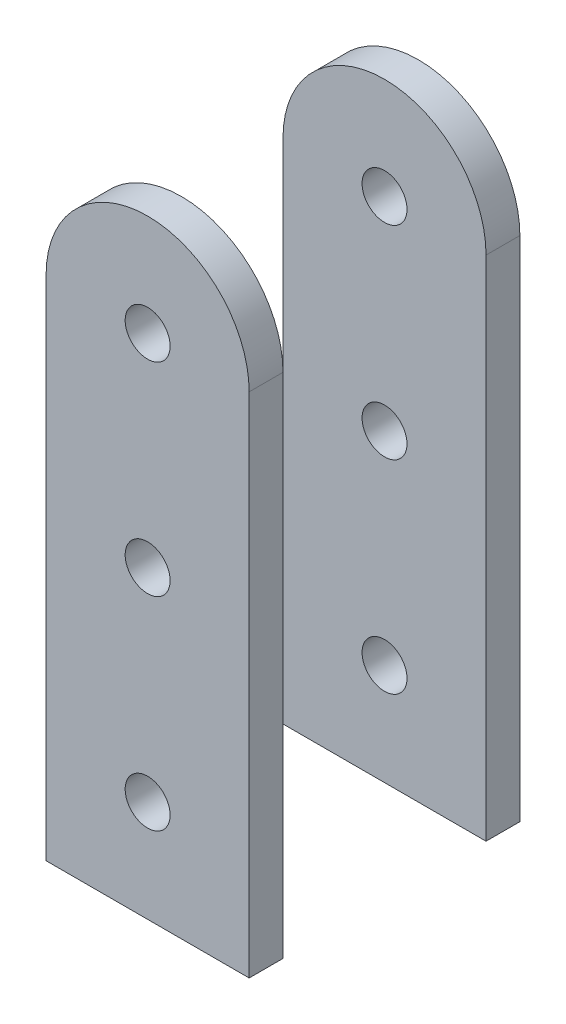
ISO-10303-21;
HEADER;
FILE_DESCRIPTION(('STEP AP214'),'2;1');
FILE_NAME('part.step','',(''),(''),'','','');
FILE_SCHEMA(('AUTOMOTIVE_DESIGN { 1 0 10303 214 1 1 1 1 }'));
ENDSEC;
DATA;
#1=APPLICATION_CONTEXT('core data for automotive mechanical design processes');
#2=APPLICATION_PROTOCOL_DEFINITION('international standard','automotive_design',2000,#1);
#3=PRODUCT_CONTEXT('',#1,'mechanical');
#4=PRODUCT('Part','Part','',(#3));
#5=PRODUCT_RELATED_PRODUCT_CATEGORY('part','',(#4));
#6=PRODUCT_DEFINITION_FORMATION('','',#4);
#7=PRODUCT_DEFINITION_CONTEXT('part definition',#1,'design');
#8=PRODUCT_DEFINITION('design','',#6,#7);
#9=PRODUCT_DEFINITION_SHAPE('','',#8);
#10=(LENGTH_UNIT() NAMED_UNIT(*) SI_UNIT(.MILLI.,.METRE.));
#11=(NAMED_UNIT(*) PLANE_ANGLE_UNIT() SI_UNIT($,.RADIAN.));
#12=(NAMED_UNIT(*) SI_UNIT($,.STERADIAN.) SOLID_ANGLE_UNIT());
#13=UNCERTAINTY_MEASURE_WITH_UNIT(LENGTH_MEASURE(1.E-05),#10,'distance_accuracy_value','');
#14=(GEOMETRIC_REPRESENTATION_CONTEXT(3) GLOBAL_UNCERTAINTY_ASSIGNED_CONTEXT((#13)) GLOBAL_UNIT_ASSIGNED_CONTEXT((#10,
#11,#12)) REPRESENTATION_CONTEXT('',''));
#15=CARTESIAN_POINT('',(0.,0.,0.));
#16=DIRECTION('',(0.,0.,1.));
#17=DIRECTION('',(1.,0.,0.));
#18=AXIS2_PLACEMENT_3D('',#15,#16,#17);
#19=CARTESIAN_POINT('',(-19.05,47.625,-50.8));
#20=DIRECTION('',(-1.,0.,0.));
#21=DIRECTION('',(0.,-1.,0.));
#22=AXIS2_PLACEMENT_3D('',#19,#20,#21);
#23=PLANE('',#22);
#24=DIRECTION('',(0.,1.,0.));
#25=VECTOR('',#24,1.);
#26=CARTESIAN_POINT('',(-19.05,47.625,-6.35));
#27=LINE('',#26,#25);
#28=CARTESIAN_POINT('',(-19.05,-47.625,-6.35));
#29=VERTEX_POINT('',#28);
#30=CARTESIAN_POINT('',(-19.05,47.625,-6.35));
#31=VERTEX_POINT('',#30);
#32=EDGE_CURVE('E118',#29,#31,#27,.T.);
#33=ORIENTED_EDGE('',*,*,#32,.F.);
#34=DIRECTION('',(0.,0.,1.));
#35=VECTOR('',#34,1.);
#36=CARTESIAN_POINT('',(-19.05,-47.625,-50.8));
#37=LINE('',#36,#35);
#38=CARTESIAN_POINT('',(-19.05,-47.625,0.));
#39=VERTEX_POINT('',#38);
#40=EDGE_CURVE('E57',#29,#39,#37,.T.);
#41=ORIENTED_EDGE('',*,*,#40,.T.);
#42=DIRECTION('',(0.,-1.,0.));
#43=VECTOR('',#42,1.);
#44=CARTESIAN_POINT('',(-19.05,47.625,0.));
#45=LINE('',#44,#43);
#46=CARTESIAN_POINT('',(-19.05,47.625,0.));
#47=VERTEX_POINT('',#46);
#48=EDGE_CURVE('E104',#47,#39,#45,.T.);
#49=ORIENTED_EDGE('',*,*,#48,.F.);
#50=DIRECTION('',(0.,0.,1.));
#51=VECTOR('',#50,1.);
#52=CARTESIAN_POINT('',(-19.05,47.625,-50.8));
#53=LINE('',#52,#51);
#54=EDGE_CURVE('E92',#31,#47,#53,.T.);
#55=ORIENTED_EDGE('',*,*,#54,.F.);
#56=EDGE_LOOP('',(#33,#41,#49,#55));
#57=FACE_BOUND('',#56,.T.);
#58=ADVANCED_FACE('F53',(#57),#23,.T.);
#59=CARTESIAN_POINT('',(0.,47.625,-50.8));
#60=DIRECTION('',(0.,0.,1.));
#61=DIRECTION('',(1.,0.,0.));
#62=AXIS2_PLACEMENT_3D('',#59,#60,#61);
#63=CYLINDRICAL_SURFACE('',#62,19.05);
#64=DIRECTION('',(0.,0.,1.));
#65=VECTOR('',#64,1.);
#66=CARTESIAN_POINT('',(19.05,47.625,-50.8));
#67=LINE('',#66,#65);
#68=CARTESIAN_POINT('',(19.05,47.625,-6.35));
#69=VERTEX_POINT('',#68);
#70=CARTESIAN_POINT('',(19.05,47.625,0.));
#71=VERTEX_POINT('',#70);
#72=EDGE_CURVE('E101',#69,#71,#67,.T.);
#73=ORIENTED_EDGE('',*,*,#72,.F.);
#74=CARTESIAN_POINT('',(0.,47.625,-6.35));
#75=DIRECTION('',(0.,0.,1.));
#76=DIRECTION('',(0.,-1.,0.));
#77=AXIS2_PLACEMENT_3D('',#74,#75,#76);
#78=CIRCLE('',#77,19.05);
#79=EDGE_CURVE('E64',#31,#69,#78,.F.);
#80=ORIENTED_EDGE('',*,*,#79,.F.);
#81=ORIENTED_EDGE('',*,*,#54,.T.);
#82=CARTESIAN_POINT('',(0.,47.625,0.));
#83=DIRECTION('',(0.,0.,1.));
#84=DIRECTION('',(-1.,0.,0.));
#85=AXIS2_PLACEMENT_3D('',#82,#83,#84);
#86=CIRCLE('',#85,19.05);
#87=EDGE_CURVE('E97',#71,#47,#86,.T.);
#88=ORIENTED_EDGE('',*,*,#87,.F.);
#89=EDGE_LOOP('',(#73,#80,#81,#88));
#90=FACE_BOUND('',#89,.T.);
#91=ADVANCED_FACE('F95',(#90),#63,.T.);
#92=CARTESIAN_POINT('',(19.05,47.625,-50.8));
#93=DIRECTION('',(1.,0.,0.));
#94=DIRECTION('',(0.,1.,0.));
#95=AXIS2_PLACEMENT_3D('',#92,#93,#94);
#96=PLANE('',#95);
#97=DIRECTION('',(0.,-1.,0.));
#98=VECTOR('',#97,1.);
#99=CARTESIAN_POINT('',(19.05,-47.625,-6.35));
#100=LINE('',#99,#98);
#101=CARTESIAN_POINT('',(19.05,-47.625,-6.35));
#102=VERTEX_POINT('',#101);
#103=EDGE_CURVE('E12',#69,#102,#100,.T.);
#104=ORIENTED_EDGE('',*,*,#103,.F.);
#105=ORIENTED_EDGE('',*,*,#72,.T.);
#106=DIRECTION('',(0.,1.,0.));
#107=VECTOR('',#106,1.);
#108=CARTESIAN_POINT('',(19.05,47.625,0.));
#109=LINE('',#108,#107);
#110=CARTESIAN_POINT('',(19.05,-47.625,0.));
#111=VERTEX_POINT('',#110);
#112=EDGE_CURVE('E116',#111,#71,#109,.T.);
#113=ORIENTED_EDGE('',*,*,#112,.F.);
#114=DIRECTION('',(0.,0.,1.));
#115=VECTOR('',#114,1.);
#116=CARTESIAN_POINT('',(19.05,-47.625,-50.8));
#117=LINE('',#116,#115);
#118=EDGE_CURVE('E147',#102,#111,#117,.T.);
#119=ORIENTED_EDGE('',*,*,#118,.F.);
#120=EDGE_LOOP('',(#104,#105,#113,#119));
#121=FACE_BOUND('',#120,.T.);
#122=ADVANCED_FACE('F160',(#121),#96,.T.);
#123=CARTESIAN_POINT('',(19.05,-47.625,-50.8));
#124=DIRECTION('',(0.,-1.,0.));
#125=DIRECTION('',(0.,0.,-1.));
#126=AXIS2_PLACEMENT_3D('',#123,#124,#125);
#127=PLANE('',#126);
#128=DIRECTION('',(1.,0.,0.));
#129=VECTOR('',#128,1.);
#130=CARTESIAN_POINT('',(-31.75,-47.625,-6.35));
#131=LINE('',#130,#129);
#132=EDGE_CURVE('E71',#29,#102,#131,.T.);
#133=ORIENTED_EDGE('',*,*,#132,.T.);
#134=ORIENTED_EDGE('',*,*,#118,.T.);
#135=DIRECTION('',(1.,0.,0.));
#136=VECTOR('',#135,1.);
#137=CARTESIAN_POINT('',(19.05,-47.625,0.));
#138=LINE('',#137,#136);
#139=EDGE_CURVE('E110',#39,#111,#138,.T.);
#140=ORIENTED_EDGE('',*,*,#139,.F.);
#141=ORIENTED_EDGE('',*,*,#40,.F.);
#142=EDGE_LOOP('',(#133,#134,#140,#141));
#143=FACE_BOUND('',#142,.T.);
#144=ADVANCED_FACE('F157',(#143),#127,.T.);
#145=CARTESIAN_POINT('',(0.,47.625,-50.8));
#146=DIRECTION('',(0.,0.,1.));
#147=DIRECTION('',(1.,0.,0.));
#148=AXIS2_PLACEMENT_3D('',#145,#146,#147);
#149=CYLINDRICAL_SURFACE('',#148,4.2164);
#150=CARTESIAN_POINT('',(0.,47.625,-6.35));
#151=DIRECTION('',(0.,0.,1.));
#152=DIRECTION('',(0.,-1.,0.));
#153=AXIS2_PLACEMENT_3D('',#150,#151,#152);
#154=CIRCLE('',#153,4.2164);
#155=CARTESIAN_POINT('',(0.,43.4086,-6.35));
#156=VERTEX_POINT('',#155);
#157=EDGE_CURVE('E134',#156,#156,#154,.F.);
#158=ORIENTED_EDGE('',*,*,#157,.T.);
#159=EDGE_LOOP('',(#158));
#160=FACE_BOUND('',#159,.T.);
#161=CARTESIAN_POINT('',(0.,47.625,0.));
#162=DIRECTION('',(0.,0.,1.));
#163=DIRECTION('',(1.,0.,0.));
#164=AXIS2_PLACEMENT_3D('',#161,#162,#163);
#165=CIRCLE('',#164,4.2164);
#166=CARTESIAN_POINT('',(4.2164,47.625,0.));
#167=VERTEX_POINT('',#166);
#168=EDGE_CURVE('E129',#167,#167,#165,.T.);
#169=ORIENTED_EDGE('',*,*,#168,.T.);
#170=EDGE_LOOP('',(#169));
#171=FACE_BOUND('',#170,.T.);
#172=ADVANCED_FACE('F173',(#160,#171),#149,.F.);
#173=CARTESIAN_POINT('',(0.,9.52499999999999,-50.8));
#174=DIRECTION('',(0.,0.,1.));
#175=DIRECTION('',(1.,0.,0.));
#176=AXIS2_PLACEMENT_3D('',#173,#174,#175);
#177=CYLINDRICAL_SURFACE('',#176,4.2164);
#178=CARTESIAN_POINT('',(0.,9.52499999999999,-6.35));
#179=DIRECTION('',(0.,0.,1.));
#180=DIRECTION('',(0.,-1.,0.));
#181=AXIS2_PLACEMENT_3D('',#178,#179,#180);
#182=CIRCLE('',#181,4.2164);
#183=CARTESIAN_POINT('',(0.,5.30859999999999,-6.35));
#184=VERTEX_POINT('',#183);
#185=EDGE_CURVE('E133',#184,#184,#182,.F.);
#186=ORIENTED_EDGE('',*,*,#185,.T.);
#187=EDGE_LOOP('',(#186));
#188=FACE_BOUND('',#187,.T.);
#189=CARTESIAN_POINT('',(0.,9.52499999999999,0.));
#190=DIRECTION('',(0.,0.,1.));
#191=DIRECTION('',(1.,0.,0.));
#192=AXIS2_PLACEMENT_3D('',#189,#190,#191);
#193=CIRCLE('',#192,4.2164);
#194=CARTESIAN_POINT('',(4.2164,9.52499999999999,0.));
#195=VERTEX_POINT('',#194);
#196=EDGE_CURVE('E135',#195,#195,#193,.T.);
#197=ORIENTED_EDGE('',*,*,#196,.T.);
#198=EDGE_LOOP('',(#197));
#199=FACE_BOUND('',#198,.T.);
#200=ADVANCED_FACE('F176',(#188,#199),#177,.F.);
#201=CARTESIAN_POINT('',(0.,-28.575,-50.8));
#202=DIRECTION('',(0.,0.,1.));
#203=DIRECTION('',(1.,0.,0.));
#204=AXIS2_PLACEMENT_3D('',#201,#202,#203);
#205=CYLINDRICAL_SURFACE('',#204,4.2164);
#206=CARTESIAN_POINT('',(0.,-28.575,-6.35));
#207=DIRECTION('',(0.,0.,1.));
#208=DIRECTION('',(0.,-1.,0.));
#209=AXIS2_PLACEMENT_3D('',#206,#207,#208);
#210=CIRCLE('',#209,4.2164);
#211=CARTESIAN_POINT('',(0.,-32.7914,-6.35));
#212=VERTEX_POINT('',#211);
#213=EDGE_CURVE('E125',#212,#212,#210,.F.);
#214=ORIENTED_EDGE('',*,*,#213,.T.);
#215=EDGE_LOOP('',(#214));
#216=FACE_BOUND('',#215,.T.);
#217=CARTESIAN_POINT('',(0.,-28.575,0.));
#218=DIRECTION('',(0.,0.,1.));
#219=DIRECTION('',(1.,0.,0.));
#220=AXIS2_PLACEMENT_3D('',#217,#218,#219);
#221=CIRCLE('',#220,4.2164);
#222=CARTESIAN_POINT('',(4.21640000000001,-28.575,0.));
#223=VERTEX_POINT('',#222);
#224=EDGE_CURVE('E111',#223,#223,#221,.T.);
#225=ORIENTED_EDGE('',*,*,#224,.T.);
#226=EDGE_LOOP('',(#225));
#227=FACE_BOUND('',#226,.T.);
#228=ADVANCED_FACE('F55',(#216,#227),#205,.F.);
#229=CARTESIAN_POINT('',(0.,47.625,0.));
#230=DIRECTION('',(0.,0.,-1.));
#231=DIRECTION('',(-1.,0.,0.));
#232=AXIS2_PLACEMENT_3D('',#229,#230,#231);
#233=PLANE('',#232);
#234=ORIENTED_EDGE('',*,*,#224,.F.);
#235=EDGE_LOOP('',(#234));
#236=FACE_BOUND('',#235,.T.);
#237=ORIENTED_EDGE('',*,*,#196,.F.);
#238=EDGE_LOOP('',(#237));
#239=FACE_BOUND('',#238,.T.);
#240=ORIENTED_EDGE('',*,*,#168,.F.);
#241=EDGE_LOOP('',(#240));
#242=FACE_BOUND('',#241,.T.);
#243=ORIENTED_EDGE('',*,*,#48,.T.);
#244=ORIENTED_EDGE('',*,*,#139,.T.);
#245=ORIENTED_EDGE('',*,*,#112,.T.);
#246=ORIENTED_EDGE('',*,*,#87,.T.);
#247=EDGE_LOOP('',(#243,#244,#245,#246));
#248=FACE_BOUND('',#247,.T.);
#249=ADVANCED_FACE('F114',(#236,#239,#242,#248),#233,.F.);
#250=CARTESIAN_POINT('',(-31.75,-47.625,-6.35));
#251=DIRECTION('',(0.,0.,1.));
#252=DIRECTION('',(0.,-1.,0.));
#253=AXIS2_PLACEMENT_3D('',#250,#251,#252);
#254=PLANE('',#253);
#255=ORIENTED_EDGE('',*,*,#32,.T.);
#256=ORIENTED_EDGE('',*,*,#79,.T.);
#257=ORIENTED_EDGE('',*,*,#103,.T.);
#258=ORIENTED_EDGE('',*,*,#132,.F.);
#259=EDGE_LOOP('',(#255,#256,#257,#258));
#260=FACE_BOUND('',#259,.T.);
#261=ORIENTED_EDGE('',*,*,#185,.F.);
#262=EDGE_LOOP('',(#261));
#263=FACE_BOUND('',#262,.T.);
#264=ORIENTED_EDGE('',*,*,#213,.F.);
#265=EDGE_LOOP('',(#264));
#266=FACE_BOUND('',#265,.T.);
#267=ORIENTED_EDGE('',*,*,#157,.F.);
#268=EDGE_LOOP('',(#267));
#269=FACE_BOUND('',#268,.T.);
#270=ADVANCED_FACE('F161',(#260,#263,#266,#269),#254,.F.);
#271=CLOSED_SHELL('',(#58,#91,#122,#144,#172,#200,#228,#249,#270));
#272=MANIFOLD_SOLID_BREP('B2',#271);
#273=CARTESIAN_POINT('',(19.05,-47.625,-50.8));
#274=DIRECTION('',(0.,-1.,0.));
#275=DIRECTION('',(0.,0.,-1.));
#276=AXIS2_PLACEMENT_3D('',#273,#274,#275);
#277=PLANE('',#276);
#278=DIRECTION('',(1.,0.,0.));
#279=VECTOR('',#278,1.);
#280=CARTESIAN_POINT('',(-31.75,-47.625,-44.45));
#281=LINE('',#280,#279);
#282=CARTESIAN_POINT('',(-19.05,-47.625,-44.45));
#283=VERTEX_POINT('',#282);
#284=CARTESIAN_POINT('',(19.05,-47.625,-44.45));
#285=VERTEX_POINT('',#284);
#286=EDGE_CURVE('E316',#283,#285,#281,.T.);
#287=ORIENTED_EDGE('',*,*,#286,.F.);
#288=DIRECTION('',(0.,0.,1.));
#289=VECTOR('',#288,1.);
#290=CARTESIAN_POINT('',(-19.05,-47.625,-50.8));
#291=LINE('',#290,#289);
#292=CARTESIAN_POINT('',(-19.05,-47.625,-50.8));
#293=VERTEX_POINT('',#292);
#294=EDGE_CURVE('E335',#293,#283,#291,.T.);
#295=ORIENTED_EDGE('',*,*,#294,.F.);
#296=DIRECTION('',(1.,0.,0.));
#297=VECTOR('',#296,1.);
#298=CARTESIAN_POINT('',(19.05,-47.625,-50.8));
#299=LINE('',#298,#297);
#300=CARTESIAN_POINT('',(19.05,-47.625,-50.8));
#301=VERTEX_POINT('',#300);
#302=EDGE_CURVE('E334',#293,#301,#299,.T.);
#303=ORIENTED_EDGE('',*,*,#302,.T.);
#304=DIRECTION('',(0.,0.,1.));
#305=VECTOR('',#304,1.);
#306=CARTESIAN_POINT('',(19.05,-47.625,-50.8));
#307=LINE('',#306,#305);
#308=EDGE_CURVE('E329',#301,#285,#307,.T.);
#309=ORIENTED_EDGE('',*,*,#308,.T.);
#310=EDGE_LOOP('',(#287,#295,#303,#309));
#311=FACE_BOUND('',#310,.T.);
#312=ADVANCED_FACE('F276',(#311),#277,.T.);
#313=CARTESIAN_POINT('',(19.05,47.625,-50.8));
#314=DIRECTION('',(1.,0.,0.));
#315=DIRECTION('',(0.,1.,0.));
#316=AXIS2_PLACEMENT_3D('',#313,#314,#315);
#317=PLANE('',#316);
#318=DIRECTION('',(0.,1.,0.));
#319=VECTOR('',#318,1.);
#320=CARTESIAN_POINT('',(19.05,66.675,-44.45));
#321=LINE('',#320,#319);
#322=CARTESIAN_POINT('',(19.05,47.625,-44.45));
#323=VERTEX_POINT('',#322);
#324=EDGE_CURVE('E320',#285,#323,#321,.T.);
#325=ORIENTED_EDGE('',*,*,#324,.F.);
#326=ORIENTED_EDGE('',*,*,#308,.F.);
#327=DIRECTION('',(0.,1.,0.));
#328=VECTOR('',#327,1.);
#329=CARTESIAN_POINT('',(19.05,47.625,-50.8));
#330=LINE('',#329,#328);
#331=CARTESIAN_POINT('',(19.05,47.625,-50.8));
#332=VERTEX_POINT('',#331);
#333=EDGE_CURVE('E342',#301,#332,#330,.T.);
#334=ORIENTED_EDGE('',*,*,#333,.T.);
#335=DIRECTION('',(0.,0.,1.));
#336=VECTOR('',#335,1.);
#337=CARTESIAN_POINT('',(19.05,47.625,-50.8));
#338=LINE('',#337,#336);
#339=EDGE_CURVE('E285',#332,#323,#338,.T.);
#340=ORIENTED_EDGE('',*,*,#339,.T.);
#341=EDGE_LOOP('',(#325,#326,#334,#340));
#342=FACE_BOUND('',#341,.T.);
#343=ADVANCED_FACE('F327',(#342),#317,.T.);
#344=CARTESIAN_POINT('',(0.,47.625,-50.8));
#345=DIRECTION('',(0.,0.,1.));
#346=DIRECTION('',(1.,0.,0.));
#347=AXIS2_PLACEMENT_3D('',#344,#345,#346);
#348=CYLINDRICAL_SURFACE('',#347,19.05);
#349=CARTESIAN_POINT('',(0.,47.625,-44.45));
#350=DIRECTION('',(0.,0.,-1.));
#351=DIRECTION('',(0.,1.,0.));
#352=AXIS2_PLACEMENT_3D('',#349,#350,#351);
#353=CIRCLE('',#352,19.05);
#354=CARTESIAN_POINT('',(-19.05,47.625,-44.45));
#355=VERTEX_POINT('',#354);
#356=EDGE_CURVE('E357',#323,#355,#353,.F.);
#357=ORIENTED_EDGE('',*,*,#356,.F.);
#358=ORIENTED_EDGE('',*,*,#339,.F.);
#359=CARTESIAN_POINT('',(0.,47.625,-50.8));
#360=DIRECTION('',(0.,0.,1.));
#361=DIRECTION('',(-1.,0.,0.));
#362=AXIS2_PLACEMENT_3D('',#359,#360,#361);
#363=CIRCLE('',#362,19.05);
#364=CARTESIAN_POINT('',(-19.05,47.625,-50.8));
#365=VERTEX_POINT('',#364);
#366=EDGE_CURVE('E338',#332,#365,#363,.T.);
#367=ORIENTED_EDGE('',*,*,#366,.T.);
#368=DIRECTION('',(0.,0.,1.));
#369=VECTOR('',#368,1.);
#370=CARTESIAN_POINT('',(-19.05,47.625,-50.8));
#371=LINE('',#370,#369);
#372=EDGE_CURVE('E51',#365,#355,#371,.T.);
#373=ORIENTED_EDGE('',*,*,#372,.T.);
#374=EDGE_LOOP('',(#357,#358,#367,#373));
#375=FACE_BOUND('',#374,.T.);
#376=ADVANCED_FACE('F391',(#375),#348,.T.);
#377=CARTESIAN_POINT('',(-19.05,47.625,-50.8));
#378=DIRECTION('',(-1.,0.,0.));
#379=DIRECTION('',(0.,-1.,0.));
#380=AXIS2_PLACEMENT_3D('',#377,#378,#379);
#381=PLANE('',#380);
#382=DIRECTION('',(0.,-1.,0.));
#383=VECTOR('',#382,1.);
#384=CARTESIAN_POINT('',(-19.05,47.625,-44.45));
#385=LINE('',#384,#383);
#386=EDGE_CURVE('E293',#355,#283,#385,.T.);
#387=ORIENTED_EDGE('',*,*,#386,.F.);
#388=ORIENTED_EDGE('',*,*,#372,.F.);
#389=DIRECTION('',(0.,-1.,0.));
#390=VECTOR('',#389,1.);
#391=CARTESIAN_POINT('',(-19.05,47.625,-50.8));
#392=LINE('',#391,#390);
#393=EDGE_CURVE('E345',#365,#293,#392,.T.);
#394=ORIENTED_EDGE('',*,*,#393,.T.);
#395=ORIENTED_EDGE('',*,*,#294,.T.);
#396=EDGE_LOOP('',(#387,#388,#394,#395));
#397=FACE_BOUND('',#396,.T.);
#398=ADVANCED_FACE('F278',(#397),#381,.T.);
#399=CARTESIAN_POINT('',(0.,47.625,-50.8));
#400=DIRECTION('',(0.,0.,1.));
#401=DIRECTION('',(1.,0.,0.));
#402=AXIS2_PLACEMENT_3D('',#399,#400,#401);
#403=CYLINDRICAL_SURFACE('',#402,4.2164);
#404=CARTESIAN_POINT('',(0.,47.625,-44.45));
#405=DIRECTION('',(0.,0.,-1.));
#406=DIRECTION('',(0.,1.,0.));
#407=AXIS2_PLACEMENT_3D('',#404,#405,#406);
#408=CIRCLE('',#407,4.2164);
#409=CARTESIAN_POINT('',(0.,51.8414,-44.45));
#410=VERTEX_POINT('',#409);
#411=EDGE_CURVE('E359',#410,#410,#408,.F.);
#412=ORIENTED_EDGE('',*,*,#411,.T.);
#413=EDGE_LOOP('',(#412));
#414=FACE_BOUND('',#413,.T.);
#415=CARTESIAN_POINT('',(0.,47.625,-50.8));
#416=DIRECTION('',(0.,0.,1.));
#417=DIRECTION('',(1.,0.,0.));
#418=AXIS2_PLACEMENT_3D('',#415,#416,#417);
#419=CIRCLE('',#418,4.2164);
#420=CARTESIAN_POINT('',(4.2164,47.625,-50.8));
#421=VERTEX_POINT('',#420);
#422=EDGE_CURVE('E347',#421,#421,#419,.T.);
#423=ORIENTED_EDGE('',*,*,#422,.F.);
#424=EDGE_LOOP('',(#423));
#425=FACE_BOUND('',#424,.T.);
#426=ADVANCED_FACE('F377',(#414,#425),#403,.F.);
#427=CARTESIAN_POINT('',(0.,9.52499999999999,-50.8));
#428=DIRECTION('',(0.,0.,1.));
#429=DIRECTION('',(1.,0.,0.));
#430=AXIS2_PLACEMENT_3D('',#427,#428,#429);
#431=CYLINDRICAL_SURFACE('',#430,4.2164);
#432=CARTESIAN_POINT('',(0.,9.52499999999999,-44.45));
#433=DIRECTION('',(0.,0.,-1.));
#434=DIRECTION('',(0.,1.,0.));
#435=AXIS2_PLACEMENT_3D('',#432,#433,#434);
#436=CIRCLE('',#435,4.2164);
#437=CARTESIAN_POINT('',(0.,13.7414,-44.45));
#438=VERTEX_POINT('',#437);
#439=EDGE_CURVE('E362',#438,#438,#436,.F.);
#440=ORIENTED_EDGE('',*,*,#439,.T.);
#441=EDGE_LOOP('',(#440));
#442=FACE_BOUND('',#441,.T.);
#443=CARTESIAN_POINT('',(0.,9.52499999999999,-50.8));
#444=DIRECTION('',(0.,0.,1.));
#445=DIRECTION('',(1.,0.,0.));
#446=AXIS2_PLACEMENT_3D('',#443,#444,#445);
#447=CIRCLE('',#446,4.2164);
#448=CARTESIAN_POINT('',(4.2164,9.52499999999999,-50.8));
#449=VERTEX_POINT('',#448);
#450=EDGE_CURVE('E350',#449,#449,#447,.T.);
#451=ORIENTED_EDGE('',*,*,#450,.F.);
#452=EDGE_LOOP('',(#451));
#453=FACE_BOUND('',#452,.T.);
#454=ADVANCED_FACE('F380',(#442,#453),#431,.F.);
#455=CARTESIAN_POINT('',(0.,47.625,-50.8));
#456=DIRECTION('',(0.,0.,-1.));
#457=DIRECTION('',(-1.,0.,0.));
#458=AXIS2_PLACEMENT_3D('',#455,#456,#457);
#459=PLANE('',#458);
#460=CARTESIAN_POINT('',(0.,-28.575,-50.8));
#461=DIRECTION('',(0.,0.,1.));
#462=DIRECTION('',(1.,0.,0.));
#463=AXIS2_PLACEMENT_3D('',#460,#461,#462);
#464=CIRCLE('',#463,4.2164);
#465=CARTESIAN_POINT('',(4.21640000000001,-28.575,-50.8));
#466=VERTEX_POINT('',#465);
#467=EDGE_CURVE('E353',#466,#466,#464,.T.);
#468=ORIENTED_EDGE('',*,*,#467,.T.);
#469=EDGE_LOOP('',(#468));
#470=FACE_BOUND('',#469,.T.);
#471=ORIENTED_EDGE('',*,*,#450,.T.);
#472=EDGE_LOOP('',(#471));
#473=FACE_BOUND('',#472,.T.);
#474=ORIENTED_EDGE('',*,*,#422,.T.);
#475=EDGE_LOOP('',(#474));
#476=FACE_BOUND('',#475,.T.);
#477=ORIENTED_EDGE('',*,*,#393,.F.);
#478=ORIENTED_EDGE('',*,*,#366,.F.);
#479=ORIENTED_EDGE('',*,*,#333,.F.);
#480=ORIENTED_EDGE('',*,*,#302,.F.);
#481=EDGE_LOOP('',(#477,#478,#479,#480));
#482=FACE_BOUND('',#481,.T.);
#483=ADVANCED_FACE('F384',(#470,#473,#476,#482),#459,.T.);
#484=CARTESIAN_POINT('',(0.,-28.575,-50.8));
#485=DIRECTION('',(0.,0.,1.));
#486=DIRECTION('',(1.,0.,0.));
#487=AXIS2_PLACEMENT_3D('',#484,#485,#486);
#488=CYLINDRICAL_SURFACE('',#487,4.2164);
#489=CARTESIAN_POINT('',(0.,-28.575,-44.45));
#490=DIRECTION('',(0.,0.,-1.));
#491=DIRECTION('',(0.,1.,0.));
#492=AXIS2_PLACEMENT_3D('',#489,#490,#491);
#493=CIRCLE('',#492,4.2164);
#494=CARTESIAN_POINT('',(0.,-24.3586,-44.45));
#495=VERTEX_POINT('',#494);
#496=EDGE_CURVE('E280',#495,#495,#493,.F.);
#497=ORIENTED_EDGE('',*,*,#496,.T.);
#498=EDGE_LOOP('',(#497));
#499=FACE_BOUND('',#498,.T.);
#500=ORIENTED_EDGE('',*,*,#467,.F.);
#501=EDGE_LOOP('',(#500));
#502=FACE_BOUND('',#501,.T.);
#503=ADVANCED_FACE('F369',(#499,#502),#488,.F.);
#504=CARTESIAN_POINT('',(-31.75,66.675,-44.45));
#505=DIRECTION('',(0.,0.,-1.));
#506=DIRECTION('',(0.,1.,0.));
#507=AXIS2_PLACEMENT_3D('',#504,#505,#506);
#508=PLANE('',#507);
#509=ORIENTED_EDGE('',*,*,#386,.T.);
#510=ORIENTED_EDGE('',*,*,#286,.T.);
#511=ORIENTED_EDGE('',*,*,#324,.T.);
#512=ORIENTED_EDGE('',*,*,#356,.T.);
#513=EDGE_LOOP('',(#509,#510,#511,#512));
#514=FACE_BOUND('',#513,.T.);
#515=ORIENTED_EDGE('',*,*,#439,.F.);
#516=EDGE_LOOP('',(#515));
#517=FACE_BOUND('',#516,.T.);
#518=ORIENTED_EDGE('',*,*,#496,.F.);
#519=EDGE_LOOP('',(#518));
#520=FACE_BOUND('',#519,.T.);
#521=ORIENTED_EDGE('',*,*,#411,.F.);
#522=EDGE_LOOP('',(#521));
#523=FACE_BOUND('',#522,.T.);
#524=ADVANCED_FACE('F318',(#514,#517,#520,#523),#508,.F.);
#525=CLOSED_SHELL('',(#312,#343,#376,#398,#426,#454,#483,#503,#524));
#526=MANIFOLD_SOLID_BREP('B6',#525);
#527=ADVANCED_BREP_SHAPE_REPRESENTATION('',(#18,#272,#526),#14);
#528=SHAPE_DEFINITION_REPRESENTATION(#9,#527);
ENDSEC;
END-ISO-10303-21;
